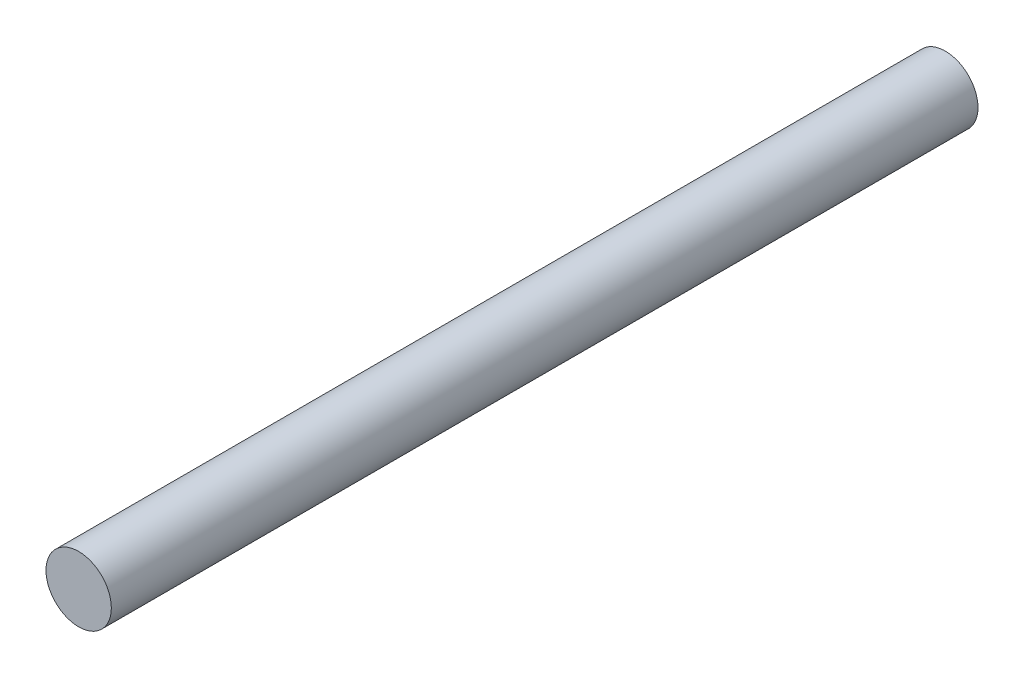
ISO-10303-21;
HEADER;
FILE_DESCRIPTION(('STEP AP214'),'2;1');
FILE_NAME('part.step','',(''),(''),'','','');
FILE_SCHEMA(('AUTOMOTIVE_DESIGN { 1 0 10303 214 1 1 1 1 }'));
ENDSEC;
DATA;
#1=APPLICATION_CONTEXT('core data for automotive mechanical design processes');
#2=APPLICATION_PROTOCOL_DEFINITION('international standard','automotive_design',2000,#1);
#3=PRODUCT_CONTEXT('',#1,'mechanical');
#4=PRODUCT('Part','Part','',(#3));
#5=PRODUCT_RELATED_PRODUCT_CATEGORY('part','',(#4));
#6=PRODUCT_DEFINITION_FORMATION('','',#4);
#7=PRODUCT_DEFINITION_CONTEXT('part definition',#1,'design');
#8=PRODUCT_DEFINITION('design','',#6,#7);
#9=PRODUCT_DEFINITION_SHAPE('','',#8);
#10=(LENGTH_UNIT() NAMED_UNIT(*) SI_UNIT(.MILLI.,.METRE.));
#11=(NAMED_UNIT(*) PLANE_ANGLE_UNIT() SI_UNIT($,.RADIAN.));
#12=(NAMED_UNIT(*) SI_UNIT($,.STERADIAN.) SOLID_ANGLE_UNIT());
#13=UNCERTAINTY_MEASURE_WITH_UNIT(LENGTH_MEASURE(1.E-05),#10,'distance_accuracy_value','');
#14=(GEOMETRIC_REPRESENTATION_CONTEXT(3) GLOBAL_UNCERTAINTY_ASSIGNED_CONTEXT((#13)) GLOBAL_UNIT_ASSIGNED_CONTEXT((#10,
#11,#12)) REPRESENTATION_CONTEXT('',''));
#15=CARTESIAN_POINT('',(0.,0.,0.));
#16=DIRECTION('',(0.,0.,1.));
#17=DIRECTION('',(1.,0.,0.));
#18=AXIS2_PLACEMENT_3D('',#15,#16,#17);
#19=CARTESIAN_POINT('',(0.,0.,29.1815438248219));
#20=DIRECTION('',(0.,0.,1.));
#21=DIRECTION('',(1.,0.,0.));
#22=AXIS2_PLACEMENT_3D('',#19,#20,#21);
#23=PLANE('',#22);
#24=CARTESIAN_POINT('',(0.,0.,29.1815438248219));
#25=DIRECTION('',(0.,0.,-1.));
#26=DIRECTION('',(-1.,0.,0.));
#27=AXIS2_PLACEMENT_3D('',#24,#25,#26);
#28=CIRCLE('',#27,2.2);
#29=CARTESIAN_POINT('',(-2.2,0.,29.1815438248219));
#30=VERTEX_POINT('',#29);
#31=EDGE_CURVE('E9',#30,#30,#28,.T.);
#32=ORIENTED_EDGE('',*,*,#31,.F.);
#33=EDGE_LOOP('',(#32));
#34=FACE_BOUND('',#33,.T.);
#35=ADVANCED_FACE('F14',(#34),#23,.T.);
#36=CARTESIAN_POINT('',(0.,0.,-29.1815438248219));
#37=DIRECTION('',(0.,0.,-1.));
#38=DIRECTION('',(-1.,0.,0.));
#39=AXIS2_PLACEMENT_3D('',#36,#37,#38);
#40=PLANE('',#39);
#41=CARTESIAN_POINT('',(0.,0.,-29.1815438248219));
#42=DIRECTION('',(0.,0.,1.));
#43=DIRECTION('',(1.,0.,0.));
#44=AXIS2_PLACEMENT_3D('',#41,#42,#43);
#45=CIRCLE('',#44,2.2);
#46=CARTESIAN_POINT('',(2.2,0.,-29.1815438248219));
#47=VERTEX_POINT('',#46);
#48=EDGE_CURVE('E21',#47,#47,#45,.T.);
#49=ORIENTED_EDGE('',*,*,#48,.F.);
#50=EDGE_LOOP('',(#49));
#51=FACE_BOUND('',#50,.T.);
#52=ADVANCED_FACE('F29',(#51),#40,.T.);
#53=CARTESIAN_POINT('',(0.,0.,-29.1815438248219));
#54=DIRECTION('',(0.,0.,1.));
#55=DIRECTION('',(1.,0.,0.));
#56=AXIS2_PLACEMENT_3D('',#53,#54,#55);
#57=CYLINDRICAL_SURFACE('',#56,2.2);
#58=ORIENTED_EDGE('',*,*,#31,.T.);
#59=EDGE_LOOP('',(#58));
#60=FACE_BOUND('',#59,.T.);
#61=ORIENTED_EDGE('',*,*,#48,.T.);
#62=EDGE_LOOP('',(#61));
#63=FACE_BOUND('',#62,.T.);
#64=ADVANCED_FACE('F16',(#60,#63),#57,.T.);
#65=CLOSED_SHELL('',(#35,#52,#64));
#66=MANIFOLD_SOLID_BREP('B1',#65);
#67=ADVANCED_BREP_SHAPE_REPRESENTATION('',(#18,#66),#14);
#68=SHAPE_DEFINITION_REPRESENTATION(#9,#67);
ENDSEC;
END-ISO-10303-21;
